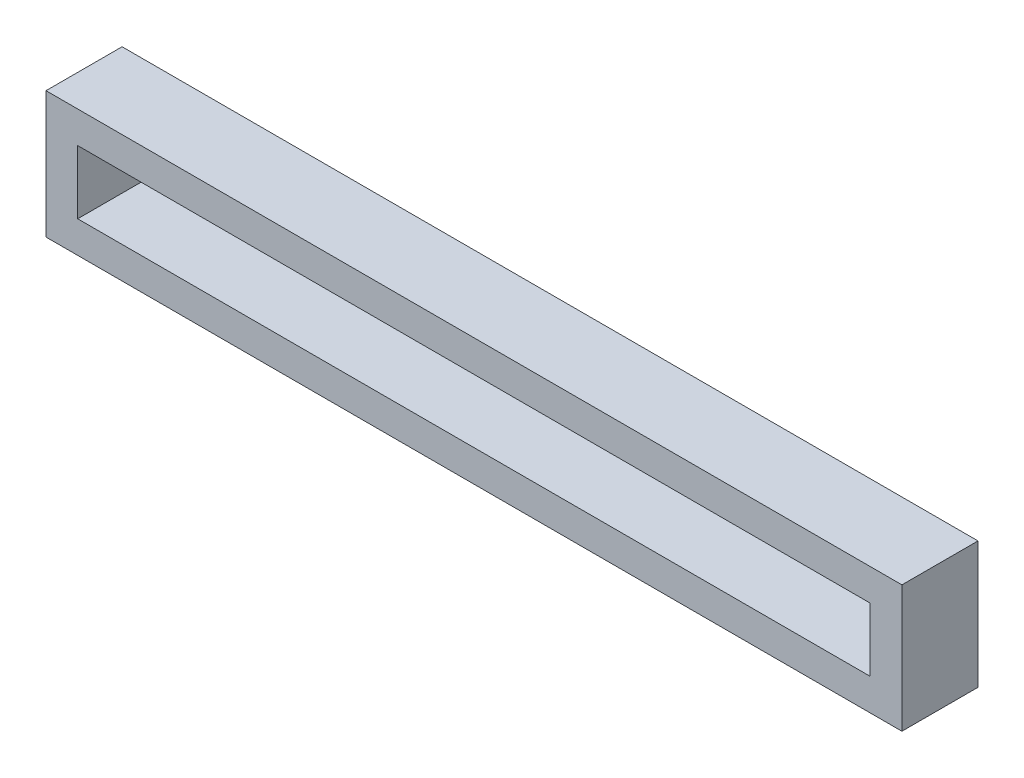
ISO-10303-21;
HEADER;
FILE_DESCRIPTION(('STEP AP214'),'2;1');
FILE_NAME('part.step','',(''),(''),'','','');
FILE_SCHEMA(('AUTOMOTIVE_DESIGN { 1 0 10303 214 1 1 1 1 }'));
ENDSEC;
DATA;
#1=APPLICATION_CONTEXT('core data for automotive mechanical design processes');
#2=APPLICATION_PROTOCOL_DEFINITION('international standard','automotive_design',2000,#1);
#3=PRODUCT_CONTEXT('',#1,'mechanical');
#4=PRODUCT('Part','Part','',(#3));
#5=PRODUCT_RELATED_PRODUCT_CATEGORY('part','',(#4));
#6=PRODUCT_DEFINITION_FORMATION('','',#4);
#7=PRODUCT_DEFINITION_CONTEXT('part definition',#1,'design');
#8=PRODUCT_DEFINITION('design','',#6,#7);
#9=PRODUCT_DEFINITION_SHAPE('','',#8);
#10=(LENGTH_UNIT() NAMED_UNIT(*) SI_UNIT(.MILLI.,.METRE.));
#11=(NAMED_UNIT(*) PLANE_ANGLE_UNIT() SI_UNIT($,.RADIAN.));
#12=(NAMED_UNIT(*) SI_UNIT($,.STERADIAN.) SOLID_ANGLE_UNIT());
#13=UNCERTAINTY_MEASURE_WITH_UNIT(LENGTH_MEASURE(1.E-05),#10,'distance_accuracy_value','');
#14=(GEOMETRIC_REPRESENTATION_CONTEXT(3) GLOBAL_UNCERTAINTY_ASSIGNED_CONTEXT((#13)) GLOBAL_UNIT_ASSIGNED_CONTEXT((#10,
#11,#12)) REPRESENTATION_CONTEXT('',''));
#15=CARTESIAN_POINT('',(0.,0.,0.));
#16=DIRECTION('',(0.,0.,1.));
#17=DIRECTION('',(1.,0.,0.));
#18=AXIS2_PLACEMENT_3D('',#15,#16,#17);
#19=CARTESIAN_POINT('',(0.,0.,10.));
#20=DIRECTION('',(0.,0.,1.));
#21=DIRECTION('',(1.,0.,0.));
#22=AXIS2_PLACEMENT_3D('',#19,#20,#21);
#23=PLANE('',#22);
#24=DIRECTION('',(-1.,0.,0.));
#25=VECTOR('',#24,1.);
#26=CARTESIAN_POINT('',(130.,15.,10.));
#27=LINE('',#26,#25);
#28=CARTESIAN_POINT('',(130.,15.,10.));
#29=VERTEX_POINT('',#28);
#30=CARTESIAN_POINT('',(-5.,15.,10.));
#31=VERTEX_POINT('',#30);
#32=EDGE_CURVE('E152',#29,#31,#27,.T.);
#33=ORIENTED_EDGE('',*,*,#32,.T.);
#34=DIRECTION('',(0.,-1.,0.));
#35=VECTOR('',#34,1.);
#36=CARTESIAN_POINT('',(-5.,15.,10.));
#37=LINE('',#36,#35);
#38=CARTESIAN_POINT('',(-5.,-5.,10.));
#39=VERTEX_POINT('',#38);
#40=EDGE_CURVE('E154',#31,#39,#37,.T.);
#41=ORIENTED_EDGE('',*,*,#40,.T.);
#42=DIRECTION('',(1.,0.,0.));
#43=VECTOR('',#42,1.);
#44=CARTESIAN_POINT('',(-5.,-5.,10.));
#45=LINE('',#44,#43);
#46=CARTESIAN_POINT('',(130.,-5.,10.));
#47=VERTEX_POINT('',#46);
#48=EDGE_CURVE('E156',#39,#47,#45,.T.);
#49=ORIENTED_EDGE('',*,*,#48,.T.);
#50=DIRECTION('',(0.,1.,0.));
#51=VECTOR('',#50,1.);
#52=CARTESIAN_POINT('',(130.,-5.,10.));
#53=LINE('',#52,#51);
#54=EDGE_CURVE('E56',#47,#29,#53,.T.);
#55=ORIENTED_EDGE('',*,*,#54,.T.);
#56=EDGE_LOOP('',(#33,#41,#49,#55));
#57=FACE_BOUND('',#56,.T.);
#58=DIRECTION('',(1.,0.,0.));
#59=VECTOR('',#58,1.);
#60=CARTESIAN_POINT('',(0.,0.,10.));
#61=LINE('',#60,#59);
#62=CARTESIAN_POINT('',(0.,0.,10.));
#63=VERTEX_POINT('',#62);
#64=CARTESIAN_POINT('',(125.,0.,10.));
#65=VERTEX_POINT('',#64);
#66=EDGE_CURVE('E127',#63,#65,#61,.T.);
#67=ORIENTED_EDGE('',*,*,#66,.F.);
#68=DIRECTION('',(0.,-1.,0.));
#69=VECTOR('',#68,1.);
#70=CARTESIAN_POINT('',(0.,10.,10.));
#71=LINE('',#70,#69);
#72=CARTESIAN_POINT('',(0.,10.,10.));
#73=VERTEX_POINT('',#72);
#74=EDGE_CURVE('E125',#73,#63,#71,.T.);
#75=ORIENTED_EDGE('',*,*,#74,.F.);
#76=DIRECTION('',(-1.,0.,0.));
#77=VECTOR('',#76,1.);
#78=CARTESIAN_POINT('',(125.,10.,10.));
#79=LINE('',#78,#77);
#80=CARTESIAN_POINT('',(125.,10.,10.));
#81=VERTEX_POINT('',#80);
#82=EDGE_CURVE('E132',#81,#73,#79,.T.);
#83=ORIENTED_EDGE('',*,*,#82,.F.);
#84=DIRECTION('',(0.,1.,0.));
#85=VECTOR('',#84,1.);
#86=CARTESIAN_POINT('',(125.,0.,10.));
#87=LINE('',#86,#85);
#88=EDGE_CURVE('E130',#65,#81,#87,.T.);
#89=ORIENTED_EDGE('',*,*,#88,.F.);
#90=EDGE_LOOP('',(#67,#75,#83,#89));
#91=FACE_BOUND('',#90,.T.);
#92=ADVANCED_FACE('F33',(#57,#91),#23,.T.);
#93=CARTESIAN_POINT('',(130.,15.,10.));
#94=DIRECTION('',(0.,-1.,0.));
#95=DIRECTION('',(0.,0.,-1.));
#96=AXIS2_PLACEMENT_3D('',#93,#94,#95);
#97=PLANE('',#96);
#98=DIRECTION('',(0.,0.,-1.));
#99=VECTOR('',#98,1.);
#100=CARTESIAN_POINT('',(130.,15.,10.));
#101=LINE('',#100,#99);
#102=CARTESIAN_POINT('',(130.,15.,-2.));
#103=VERTEX_POINT('',#102);
#104=EDGE_CURVE('E105',#29,#103,#101,.T.);
#105=ORIENTED_EDGE('',*,*,#104,.T.);
#106=DIRECTION('',(1.,0.,0.));
#107=VECTOR('',#106,1.);
#108=CARTESIAN_POINT('',(130.,15.,-2.));
#109=LINE('',#108,#107);
#110=CARTESIAN_POINT('',(-5.,15.,-2.));
#111=VERTEX_POINT('',#110);
#112=EDGE_CURVE('E119',#111,#103,#109,.T.);
#113=ORIENTED_EDGE('',*,*,#112,.F.);
#114=DIRECTION('',(0.,0.,-1.));
#115=VECTOR('',#114,1.);
#116=CARTESIAN_POINT('',(-5.,15.,10.));
#117=LINE('',#116,#115);
#118=EDGE_CURVE('E11',#31,#111,#117,.T.);
#119=ORIENTED_EDGE('',*,*,#118,.F.);
#120=ORIENTED_EDGE('',*,*,#32,.F.);
#121=EDGE_LOOP('',(#105,#113,#119,#120));
#122=FACE_BOUND('',#121,.T.);
#123=ADVANCED_FACE('F35',(#122),#97,.F.);
#124=CARTESIAN_POINT('',(-5.,15.,10.));
#125=DIRECTION('',(1.,0.,0.));
#126=DIRECTION('',(0.,0.,-1.));
#127=AXIS2_PLACEMENT_3D('',#124,#125,#126);
#128=PLANE('',#127);
#129=ORIENTED_EDGE('',*,*,#118,.T.);
#130=DIRECTION('',(0.,1.,0.));
#131=VECTOR('',#130,1.);
#132=CARTESIAN_POINT('',(-5.,15.,-2.));
#133=LINE('',#132,#131);
#134=CARTESIAN_POINT('',(-5.,-5.,-2.));
#135=VERTEX_POINT('',#134);
#136=EDGE_CURVE('E114',#135,#111,#133,.T.);
#137=ORIENTED_EDGE('',*,*,#136,.F.);
#138=DIRECTION('',(0.,0.,-1.));
#139=VECTOR('',#138,1.);
#140=CARTESIAN_POINT('',(-5.,-5.,10.));
#141=LINE('',#140,#139);
#142=EDGE_CURVE('E41',#39,#135,#141,.T.);
#143=ORIENTED_EDGE('',*,*,#142,.F.);
#144=ORIENTED_EDGE('',*,*,#40,.F.);
#145=EDGE_LOOP('',(#129,#137,#143,#144));
#146=FACE_BOUND('',#145,.T.);
#147=ADVANCED_FACE('F164',(#146),#128,.F.);
#148=CARTESIAN_POINT('',(-5.,-5.,10.));
#149=DIRECTION('',(0.,1.,0.));
#150=DIRECTION('',(0.,0.,1.));
#151=AXIS2_PLACEMENT_3D('',#148,#149,#150);
#152=PLANE('',#151);
#153=ORIENTED_EDGE('',*,*,#142,.T.);
#154=DIRECTION('',(-1.,0.,0.));
#155=VECTOR('',#154,1.);
#156=CARTESIAN_POINT('',(130.,-5.,-2.));
#157=LINE('',#156,#155);
#158=CARTESIAN_POINT('',(130.,-5.,-2.));
#159=VERTEX_POINT('',#158);
#160=EDGE_CURVE('E108',#159,#135,#157,.T.);
#161=ORIENTED_EDGE('',*,*,#160,.F.);
#162=DIRECTION('',(0.,0.,-1.));
#163=VECTOR('',#162,1.);
#164=CARTESIAN_POINT('',(130.,-5.,10.));
#165=LINE('',#164,#163);
#166=EDGE_CURVE('E98',#47,#159,#165,.T.);
#167=ORIENTED_EDGE('',*,*,#166,.F.);
#168=ORIENTED_EDGE('',*,*,#48,.F.);
#169=EDGE_LOOP('',(#153,#161,#167,#168));
#170=FACE_BOUND('',#169,.T.);
#171=ADVANCED_FACE('F109',(#170),#152,.F.);
#172=CARTESIAN_POINT('',(130.,-5.,10.));
#173=DIRECTION('',(-1.,0.,0.));
#174=DIRECTION('',(0.,0.,1.));
#175=AXIS2_PLACEMENT_3D('',#172,#173,#174);
#176=PLANE('',#175);
#177=ORIENTED_EDGE('',*,*,#166,.T.);
#178=DIRECTION('',(0.,-1.,0.));
#179=VECTOR('',#178,1.);
#180=CARTESIAN_POINT('',(130.,15.,-2.));
#181=LINE('',#180,#179);
#182=EDGE_CURVE('E102',#103,#159,#181,.T.);
#183=ORIENTED_EDGE('',*,*,#182,.F.);
#184=ORIENTED_EDGE('',*,*,#104,.F.);
#185=ORIENTED_EDGE('',*,*,#54,.F.);
#186=EDGE_LOOP('',(#177,#183,#184,#185));
#187=FACE_BOUND('',#186,.T.);
#188=ADVANCED_FACE('F100',(#187),#176,.F.);
#189=CARTESIAN_POINT('',(0.,10.,10.));
#190=DIRECTION('',(1.,0.,0.));
#191=DIRECTION('',(0.,0.,-1.));
#192=AXIS2_PLACEMENT_3D('',#189,#190,#191);
#193=PLANE('',#192);
#194=DIRECTION('',(0.,-1.,0.));
#195=VECTOR('',#194,1.);
#196=CARTESIAN_POINT('',(0.,10.,0.));
#197=LINE('',#196,#195);
#198=CARTESIAN_POINT('',(0.,10.,0.));
#199=VERTEX_POINT('',#198);
#200=CARTESIAN_POINT('',(0.,0.,0.));
#201=VERTEX_POINT('',#200);
#202=EDGE_CURVE('E124',#199,#201,#197,.T.);
#203=ORIENTED_EDGE('',*,*,#202,.F.);
#204=DIRECTION('',(0.,0.,-1.));
#205=VECTOR('',#204,1.);
#206=CARTESIAN_POINT('',(0.,10.,10.));
#207=LINE('',#206,#205);
#208=EDGE_CURVE('E134',#73,#199,#207,.T.);
#209=ORIENTED_EDGE('',*,*,#208,.F.);
#210=ORIENTED_EDGE('',*,*,#74,.T.);
#211=DIRECTION('',(0.,0.,-1.));
#212=VECTOR('',#211,1.);
#213=CARTESIAN_POINT('',(0.,0.,10.));
#214=LINE('',#213,#212);
#215=EDGE_CURVE('E149',#63,#201,#214,.T.);
#216=ORIENTED_EDGE('',*,*,#215,.T.);
#217=EDGE_LOOP('',(#203,#209,#210,#216));
#218=FACE_BOUND('',#217,.T.);
#219=ADVANCED_FACE('F177',(#218),#193,.T.);
#220=CARTESIAN_POINT('',(0.,0.,10.));
#221=DIRECTION('',(0.,1.,0.));
#222=DIRECTION('',(0.,0.,1.));
#223=AXIS2_PLACEMENT_3D('',#220,#221,#222);
#224=PLANE('',#223);
#225=DIRECTION('',(1.,0.,0.));
#226=VECTOR('',#225,1.);
#227=CARTESIAN_POINT('',(0.,0.,0.));
#228=LINE('',#227,#226);
#229=CARTESIAN_POINT('',(125.,0.,0.));
#230=VERTEX_POINT('',#229);
#231=EDGE_CURVE('E137',#201,#230,#228,.T.);
#232=ORIENTED_EDGE('',*,*,#231,.F.);
#233=ORIENTED_EDGE('',*,*,#215,.F.);
#234=ORIENTED_EDGE('',*,*,#66,.T.);
#235=DIRECTION('',(0.,0.,-1.));
#236=VECTOR('',#235,1.);
#237=CARTESIAN_POINT('',(125.,0.,10.));
#238=LINE('',#237,#236);
#239=EDGE_CURVE('E147',#65,#230,#238,.T.);
#240=ORIENTED_EDGE('',*,*,#239,.T.);
#241=EDGE_LOOP('',(#232,#233,#234,#240));
#242=FACE_BOUND('',#241,.T.);
#243=ADVANCED_FACE('F183',(#242),#224,.T.);
#244=CARTESIAN_POINT('',(125.,0.,10.));
#245=DIRECTION('',(-1.,0.,0.));
#246=DIRECTION('',(0.,0.,1.));
#247=AXIS2_PLACEMENT_3D('',#244,#245,#246);
#248=PLANE('',#247);
#249=DIRECTION('',(0.,1.,0.));
#250=VECTOR('',#249,1.);
#251=CARTESIAN_POINT('',(125.,0.,0.));
#252=LINE('',#251,#250);
#253=CARTESIAN_POINT('',(125.,10.,0.));
#254=VERTEX_POINT('',#253);
#255=EDGE_CURVE('E140',#230,#254,#252,.T.);
#256=ORIENTED_EDGE('',*,*,#255,.F.);
#257=ORIENTED_EDGE('',*,*,#239,.F.);
#258=ORIENTED_EDGE('',*,*,#88,.T.);
#259=DIRECTION('',(0.,0.,-1.));
#260=VECTOR('',#259,1.);
#261=CARTESIAN_POINT('',(125.,10.,10.));
#262=LINE('',#261,#260);
#263=EDGE_CURVE('E48',#81,#254,#262,.T.);
#264=ORIENTED_EDGE('',*,*,#263,.T.);
#265=EDGE_LOOP('',(#256,#257,#258,#264));
#266=FACE_BOUND('',#265,.T.);
#267=ADVANCED_FACE('F188',(#266),#248,.T.);
#268=CARTESIAN_POINT('',(125.,10.,10.));
#269=DIRECTION('',(0.,-1.,0.));
#270=DIRECTION('',(0.,0.,-1.));
#271=AXIS2_PLACEMENT_3D('',#268,#269,#270);
#272=PLANE('',#271);
#273=DIRECTION('',(-1.,0.,0.));
#274=VECTOR('',#273,1.);
#275=CARTESIAN_POINT('',(125.,10.,0.));
#276=LINE('',#275,#274);
#277=EDGE_CURVE('E128',#254,#199,#276,.T.);
#278=ORIENTED_EDGE('',*,*,#277,.F.);
#279=ORIENTED_EDGE('',*,*,#263,.F.);
#280=ORIENTED_EDGE('',*,*,#82,.T.);
#281=ORIENTED_EDGE('',*,*,#208,.T.);
#282=EDGE_LOOP('',(#278,#279,#280,#281));
#283=FACE_BOUND('',#282,.T.);
#284=ADVANCED_FACE('F197',(#283),#272,.T.);
#285=CARTESIAN_POINT('',(0.,0.,0.));
#286=DIRECTION('',(0.,0.,-1.));
#287=DIRECTION('',(-1.,0.,0.));
#288=AXIS2_PLACEMENT_3D('',#285,#286,#287);
#289=PLANE('',#288);
#290=ORIENTED_EDGE('',*,*,#277,.T.);
#291=ORIENTED_EDGE('',*,*,#202,.T.);
#292=ORIENTED_EDGE('',*,*,#231,.T.);
#293=ORIENTED_EDGE('',*,*,#255,.T.);
#294=EDGE_LOOP('',(#290,#291,#292,#293));
#295=FACE_BOUND('',#294,.T.);
#296=ADVANCED_FACE('F195',(#295),#289,.F.);
#297=CARTESIAN_POINT('',(0.,0.,-2.));
#298=DIRECTION('',(0.,0.,-1.));
#299=DIRECTION('',(-1.,0.,0.));
#300=AXIS2_PLACEMENT_3D('',#297,#298,#299);
#301=PLANE('',#300);
#302=ORIENTED_EDGE('',*,*,#182,.T.);
#303=ORIENTED_EDGE('',*,*,#160,.T.);
#304=ORIENTED_EDGE('',*,*,#136,.T.);
#305=ORIENTED_EDGE('',*,*,#112,.T.);
#306=EDGE_LOOP('',(#302,#303,#304,#305));
#307=FACE_BOUND('',#306,.T.);
#308=ADVANCED_FACE('F117',(#307),#301,.T.);
#309=CLOSED_SHELL('',(#92,#123,#147,#171,#188,#219,#243,#267,#284,#296,#308));
#310=MANIFOLD_SOLID_BREP('B2',#309);
#311=ADVANCED_BREP_SHAPE_REPRESENTATION('',(#18,#310),#14);
#312=SHAPE_DEFINITION_REPRESENTATION(#9,#311);
ENDSEC;
END-ISO-10303-21;
